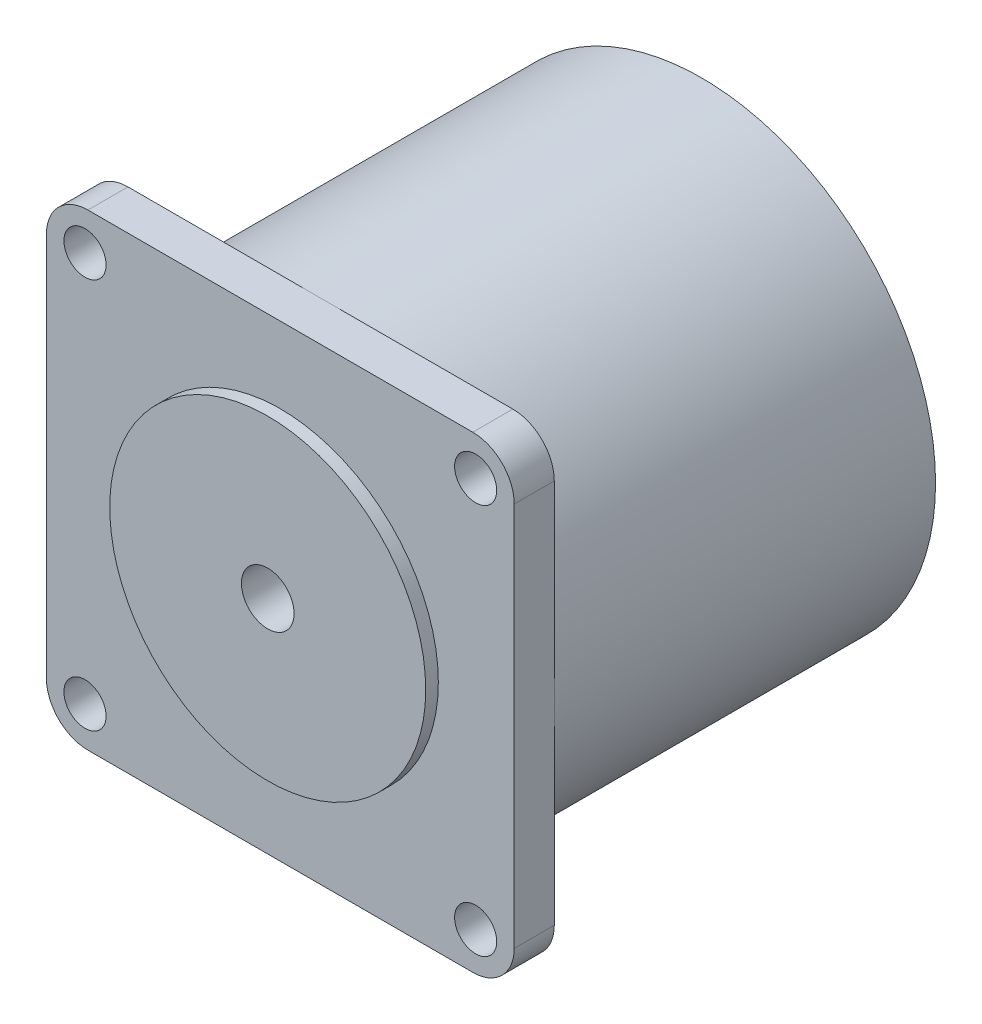
ISO-10303-21;
HEADER;
FILE_DESCRIPTION(('STEP AP214'),'2;1');
FILE_NAME('part.step','',(''),(''),'','','');
FILE_SCHEMA(('AUTOMOTIVE_DESIGN { 1 0 10303 214 1 1 1 1 }'));
ENDSEC;
DATA;
#1=APPLICATION_CONTEXT('core data for automotive mechanical design processes');
#2=APPLICATION_PROTOCOL_DEFINITION('international standard','automotive_design',2000,#1);
#3=PRODUCT_CONTEXT('',#1,'mechanical');
#4=PRODUCT('Part','Part','',(#3));
#5=PRODUCT_RELATED_PRODUCT_CATEGORY('part','',(#4));
#6=PRODUCT_DEFINITION_FORMATION('','',#4);
#7=PRODUCT_DEFINITION_CONTEXT('part definition',#1,'design');
#8=PRODUCT_DEFINITION('design','',#6,#7);
#9=PRODUCT_DEFINITION_SHAPE('','',#8);
#10=(LENGTH_UNIT() NAMED_UNIT(*) SI_UNIT(.MILLI.,.METRE.));
#11=(NAMED_UNIT(*) PLANE_ANGLE_UNIT() SI_UNIT($,.RADIAN.));
#12=(NAMED_UNIT(*) SI_UNIT($,.STERADIAN.) SOLID_ANGLE_UNIT());
#13=UNCERTAINTY_MEASURE_WITH_UNIT(LENGTH_MEASURE(1.E-05),#10,'distance_accuracy_value','');
#14=(GEOMETRIC_REPRESENTATION_CONTEXT(3) GLOBAL_UNCERTAINTY_ASSIGNED_CONTEXT((#13)) GLOBAL_UNIT_ASSIGNED_CONTEXT((#10,
#11,#12)) REPRESENTATION_CONTEXT('',''));
#15=CARTESIAN_POINT('',(0.,0.,0.));
#16=DIRECTION('',(0.,0.,1.));
#17=DIRECTION('',(1.,0.,0.));
#18=AXIS2_PLACEMENT_3D('',#15,#16,#17);
#19=CARTESIAN_POINT('',(0.,0.,45.97));
#20=DIRECTION('',(0.,0.,-1.));
#21=DIRECTION('',(-1.,0.,0.));
#22=AXIS2_PLACEMENT_3D('',#19,#20,#21);
#23=CYLINDRICAL_SURFACE('',#22,28.2);
#24=CARTESIAN_POINT('',(0.,0.,45.97));
#25=DIRECTION('',(0.,0.,1.));
#26=DIRECTION('',(1.,0.,0.));
#27=AXIS2_PLACEMENT_3D('',#24,#25,#26);
#28=CIRCLE('',#27,28.2);
#29=CARTESIAN_POINT('',(28.2,0.,45.97));
#30=VERTEX_POINT('',#29);
#31=CARTESIAN_POINT('',(0.,28.2,45.97));
#32=VERTEX_POINT('',#31);
#33=EDGE_CURVE('E38',#30,#32,#28,.T.);
#34=ORIENTED_EDGE('',*,*,#33,.F.);
#35=CARTESIAN_POINT('',(0.,-28.2,45.97));
#36=VERTEX_POINT('',#35);
#37=EDGE_CURVE('E50',#36,#30,#28,.T.);
#38=ORIENTED_EDGE('',*,*,#37,.F.);
#39=CARTESIAN_POINT('',(-28.2,0.,45.97));
#40=VERTEX_POINT('',#39);
#41=EDGE_CURVE('E54',#40,#36,#28,.T.);
#42=ORIENTED_EDGE('',*,*,#41,.F.);
#43=EDGE_CURVE('E117',#32,#40,#28,.T.);
#44=ORIENTED_EDGE('',*,*,#43,.F.);
#45=EDGE_LOOP('',(#34,#38,#42,#44));
#46=FACE_BOUND('',#45,.T.);
#47=CARTESIAN_POINT('',(0.,0.,0.));
#48=DIRECTION('',(0.,0.,1.));
#49=DIRECTION('',(1.,0.,0.));
#50=AXIS2_PLACEMENT_3D('',#47,#48,#49);
#51=CIRCLE('',#50,28.2);
#52=CARTESIAN_POINT('',(28.2,0.,0.));
#53=VERTEX_POINT('',#52);
#54=EDGE_CURVE('E131',#53,#53,#51,.T.);
#55=ORIENTED_EDGE('',*,*,#54,.T.);
#56=EDGE_LOOP('',(#55));
#57=FACE_BOUND('',#56,.T.);
#58=ADVANCED_FACE('F35',(#46,#57),#23,.T.);
#59=CARTESIAN_POINT('',(0.,0.,0.));
#60=DIRECTION('',(0.,0.,1.));
#61=DIRECTION('',(1.,0.,0.));
#62=AXIS2_PLACEMENT_3D('',#59,#60,#61);
#63=PLANE('',#62);
#64=ORIENTED_EDGE('',*,*,#54,.F.);
#65=EDGE_LOOP('',(#64));
#66=FACE_BOUND('',#65,.T.);
#67=ADVANCED_FACE('F251',(#66),#63,.F.);
#68=CARTESIAN_POINT('',(-23.2,23.2,45.97));
#69=DIRECTION('',(0.,0.,1.));
#70=DIRECTION('',(1.,0.,0.));
#71=AXIS2_PLACEMENT_3D('',#68,#69,#70);
#72=PLANE('',#71);
#73=CARTESIAN_POINT('',(23.55,23.55,45.97));
#74=DIRECTION('',(0.,0.,1.));
#75=DIRECTION('',(1.,0.,0.));
#76=AXIS2_PLACEMENT_3D('',#73,#74,#75);
#77=CIRCLE('',#76,2.54);
#78=CARTESIAN_POINT('',(26.09,23.55,45.97));
#79=VERTEX_POINT('',#78);
#80=EDGE_CURVE('E355',#79,#79,#77,.T.);
#81=ORIENTED_EDGE('',*,*,#80,.T.);
#82=EDGE_LOOP('',(#81));
#83=FACE_BOUND('',#82,.T.);
#84=DIRECTION('',(0.,1.,0.));
#85=VECTOR('',#84,1.);
#86=CARTESIAN_POINT('',(28.2,-23.2,45.97));
#87=LINE('',#86,#85);
#88=CARTESIAN_POINT('',(28.2,23.2,45.97));
#89=VERTEX_POINT('',#88);
#90=EDGE_CURVE('E151',#30,#89,#87,.T.);
#91=ORIENTED_EDGE('',*,*,#90,.F.);
#92=ORIENTED_EDGE('',*,*,#33,.T.);
#93=DIRECTION('',(1.,0.,0.));
#94=VECTOR('',#93,1.);
#95=CARTESIAN_POINT('',(-23.2,28.2,45.97));
#96=LINE('',#95,#94);
#97=CARTESIAN_POINT('',(23.2,28.2,45.97));
#98=VERTEX_POINT('',#97);
#99=EDGE_CURVE('E158',#32,#98,#96,.T.);
#100=ORIENTED_EDGE('',*,*,#99,.T.);
#101=CARTESIAN_POINT('',(23.2,23.2,45.97));
#102=DIRECTION('',(0.,0.,1.));
#103=DIRECTION('',(1.,0.,0.));
#104=AXIS2_PLACEMENT_3D('',#101,#102,#103);
#105=CIRCLE('',#104,5.00000000000001);
#106=EDGE_CURVE('E155',#89,#98,#105,.T.);
#107=ORIENTED_EDGE('',*,*,#106,.F.);
#108=EDGE_LOOP('',(#91,#92,#100,#107));
#109=FACE_BOUND('',#108,.T.);
#110=ADVANCED_FACE('F203',(#83,#109),#72,.F.);
#111=CARTESIAN_POINT('',(-23.55,23.55,45.97));
#112=DIRECTION('',(0.,0.,1.));
#113=DIRECTION('',(1.,0.,0.));
#114=AXIS2_PLACEMENT_3D('',#111,#112,#113);
#115=CIRCLE('',#114,2.54);
#116=CARTESIAN_POINT('',(-21.01,23.55,45.97));
#117=VERTEX_POINT('',#116);
#118=EDGE_CURVE('E139',#117,#117,#115,.T.);
#119=ORIENTED_EDGE('',*,*,#118,.T.);
#120=EDGE_LOOP('',(#119));
#121=FACE_BOUND('',#120,.T.);
#122=CARTESIAN_POINT('',(-23.2,28.2,45.97));
#123=VERTEX_POINT('',#122);
#124=EDGE_CURVE('E159',#123,#32,#96,.T.);
#125=ORIENTED_EDGE('',*,*,#124,.T.);
#126=ORIENTED_EDGE('',*,*,#43,.T.);
#127=DIRECTION('',(0.,-1.,0.));
#128=VECTOR('',#127,1.);
#129=CARTESIAN_POINT('',(-28.2,23.2,45.97));
#130=LINE('',#129,#128);
#131=CARTESIAN_POINT('',(-28.2,23.2,45.97));
#132=VERTEX_POINT('',#131);
#133=EDGE_CURVE('E110',#132,#40,#130,.T.);
#134=ORIENTED_EDGE('',*,*,#133,.F.);
#135=CARTESIAN_POINT('',(-23.2,23.2,45.97));
#136=DIRECTION('',(0.,0.,1.));
#137=DIRECTION('',(1.,0.,0.));
#138=AXIS2_PLACEMENT_3D('',#135,#136,#137);
#139=CIRCLE('',#138,5.);
#140=EDGE_CURVE('E115',#123,#132,#139,.T.);
#141=ORIENTED_EDGE('',*,*,#140,.F.);
#142=EDGE_LOOP('',(#125,#126,#134,#141));
#143=FACE_BOUND('',#142,.T.);
#144=ADVANCED_FACE('F113',(#121,#143),#72,.F.);
#145=CARTESIAN_POINT('',(-23.55,-23.55,45.97));
#146=DIRECTION('',(0.,0.,1.));
#147=DIRECTION('',(1.,0.,0.));
#148=AXIS2_PLACEMENT_3D('',#145,#146,#147);
#149=CIRCLE('',#148,2.54);
#150=CARTESIAN_POINT('',(-21.01,-23.55,45.97));
#151=VERTEX_POINT('',#150);
#152=EDGE_CURVE('E364',#151,#151,#149,.T.);
#153=ORIENTED_EDGE('',*,*,#152,.T.);
#154=EDGE_LOOP('',(#153));
#155=FACE_BOUND('',#154,.T.);
#156=CARTESIAN_POINT('',(-28.2,-23.2,45.97));
#157=VERTEX_POINT('',#156);
#158=EDGE_CURVE('E121',#40,#157,#130,.T.);
#159=ORIENTED_EDGE('',*,*,#158,.F.);
#160=ORIENTED_EDGE('',*,*,#41,.T.);
#161=DIRECTION('',(-1.,0.,0.));
#162=VECTOR('',#161,1.);
#163=CARTESIAN_POINT('',(23.2,-28.2,45.97));
#164=LINE('',#163,#162);
#165=CARTESIAN_POINT('',(-23.2,-28.2,45.97));
#166=VERTEX_POINT('',#165);
#167=EDGE_CURVE('E144',#36,#166,#164,.T.);
#168=ORIENTED_EDGE('',*,*,#167,.T.);
#169=CARTESIAN_POINT('',(-23.2,-23.2,45.97));
#170=DIRECTION('',(0.,0.,1.));
#171=DIRECTION('',(1.,0.,0.));
#172=AXIS2_PLACEMENT_3D('',#169,#170,#171);
#173=CIRCLE('',#172,5.);
#174=EDGE_CURVE('E120',#157,#166,#173,.T.);
#175=ORIENTED_EDGE('',*,*,#174,.F.);
#176=EDGE_LOOP('',(#159,#160,#168,#175));
#177=FACE_BOUND('',#176,.T.);
#178=ADVANCED_FACE('F229',(#155,#177),#72,.F.);
#179=CARTESIAN_POINT('',(23.55,-23.55,45.97));
#180=DIRECTION('',(0.,0.,1.));
#181=DIRECTION('',(1.,0.,0.));
#182=AXIS2_PLACEMENT_3D('',#179,#180,#181);
#183=CIRCLE('',#182,2.54);
#184=CARTESIAN_POINT('',(26.09,-23.55,45.97));
#185=VERTEX_POINT('',#184);
#186=EDGE_CURVE('E350',#185,#185,#183,.T.);
#187=ORIENTED_EDGE('',*,*,#186,.T.);
#188=EDGE_LOOP('',(#187));
#189=FACE_BOUND('',#188,.T.);
#190=CARTESIAN_POINT('',(23.2,-28.2,45.97));
#191=VERTEX_POINT('',#190);
#192=EDGE_CURVE('E145',#191,#36,#164,.T.);
#193=ORIENTED_EDGE('',*,*,#192,.T.);
#194=ORIENTED_EDGE('',*,*,#37,.T.);
#195=CARTESIAN_POINT('',(28.2,-23.2,45.97));
#196=VERTEX_POINT('',#195);
#197=EDGE_CURVE('E152',#196,#30,#87,.T.);
#198=ORIENTED_EDGE('',*,*,#197,.F.);
#199=CARTESIAN_POINT('',(23.2,-23.2,45.97));
#200=DIRECTION('',(0.,0.,-1.));
#201=DIRECTION('',(-1.,0.,0.));
#202=AXIS2_PLACEMENT_3D('',#199,#200,#201);
#203=CIRCLE('',#202,5.);
#204=EDGE_CURVE('E148',#196,#191,#203,.T.);
#205=ORIENTED_EDGE('',*,*,#204,.T.);
#206=EDGE_LOOP('',(#193,#194,#198,#205));
#207=FACE_BOUND('',#206,.T.);
#208=ADVANCED_FACE('F218',(#189,#207),#72,.F.);
#209=CARTESIAN_POINT('',(-23.2,23.2,50.8));
#210=DIRECTION('',(0.,0.,-1.));
#211=DIRECTION('',(-1.,0.,0.));
#212=AXIS2_PLACEMENT_3D('',#209,#210,#211);
#213=CYLINDRICAL_SURFACE('',#212,5.);
#214=ORIENTED_EDGE('',*,*,#140,.T.);
#215=DIRECTION('',(0.,0.,-1.));
#216=VECTOR('',#215,1.);
#217=CARTESIAN_POINT('',(-28.2,23.2,50.8));
#218=LINE('',#217,#216);
#219=CARTESIAN_POINT('',(-28.2,23.2,50.8));
#220=VERTEX_POINT('',#219);
#221=EDGE_CURVE('E124',#220,#132,#218,.T.);
#222=ORIENTED_EDGE('',*,*,#221,.F.);
#223=CARTESIAN_POINT('',(-23.2,23.2,50.8));
#224=DIRECTION('',(0.,0.,1.));
#225=DIRECTION('',(1.,0.,0.));
#226=AXIS2_PLACEMENT_3D('',#223,#224,#225);
#227=CIRCLE('',#226,5.);
#228=CARTESIAN_POINT('',(-23.2,28.2,50.8));
#229=VERTEX_POINT('',#228);
#230=EDGE_CURVE('E161',#229,#220,#227,.T.);
#231=ORIENTED_EDGE('',*,*,#230,.F.);
#232=DIRECTION('',(0.,0.,-1.));
#233=VECTOR('',#232,1.);
#234=CARTESIAN_POINT('',(-23.2,28.2,50.8));
#235=LINE('',#234,#233);
#236=EDGE_CURVE('E135',#229,#123,#235,.T.);
#237=ORIENTED_EDGE('',*,*,#236,.T.);
#238=EDGE_LOOP('',(#214,#222,#231,#237));
#239=FACE_BOUND('',#238,.T.);
#240=ADVANCED_FACE('F134',(#239),#213,.T.);
#241=CARTESIAN_POINT('',(-28.2,23.2,50.8));
#242=DIRECTION('',(1.,0.,0.));
#243=DIRECTION('',(0.,1.,0.));
#244=AXIS2_PLACEMENT_3D('',#241,#242,#243);
#245=PLANE('',#244);
#246=ORIENTED_EDGE('',*,*,#133,.T.);
#247=ORIENTED_EDGE('',*,*,#158,.T.);
#248=DIRECTION('',(0.,0.,-1.));
#249=VECTOR('',#248,1.);
#250=CARTESIAN_POINT('',(-28.2,-23.2,50.8));
#251=LINE('',#250,#249);
#252=CARTESIAN_POINT('',(-28.2,-23.2,50.8));
#253=VERTEX_POINT('',#252);
#254=EDGE_CURVE('E132',#253,#157,#251,.T.);
#255=ORIENTED_EDGE('',*,*,#254,.F.);
#256=DIRECTION('',(0.,-1.,0.));
#257=VECTOR('',#256,1.);
#258=CARTESIAN_POINT('',(-28.2,23.2,50.8));
#259=LINE('',#258,#257);
#260=EDGE_CURVE('E127',#220,#253,#259,.T.);
#261=ORIENTED_EDGE('',*,*,#260,.F.);
#262=ORIENTED_EDGE('',*,*,#221,.T.);
#263=EDGE_LOOP('',(#246,#247,#255,#261,#262));
#264=FACE_BOUND('',#263,.T.);
#265=ADVANCED_FACE('F125',(#264),#245,.F.);
#266=CARTESIAN_POINT('',(-23.2,-23.2,50.8));
#267=DIRECTION('',(0.,0.,-1.));
#268=DIRECTION('',(-1.,0.,0.));
#269=AXIS2_PLACEMENT_3D('',#266,#267,#268);
#270=CYLINDRICAL_SURFACE('',#269,5.);
#271=ORIENTED_EDGE('',*,*,#174,.T.);
#272=DIRECTION('',(0.,0.,-1.));
#273=VECTOR('',#272,1.);
#274=CARTESIAN_POINT('',(-23.2,-28.2,50.8));
#275=LINE('',#274,#273);
#276=CARTESIAN_POINT('',(-23.2,-28.2,50.8));
#277=VERTEX_POINT('',#276);
#278=EDGE_CURVE('E190',#277,#166,#275,.T.);
#279=ORIENTED_EDGE('',*,*,#278,.F.);
#280=CARTESIAN_POINT('',(-23.2,-23.2,50.8));
#281=DIRECTION('',(0.,0.,1.));
#282=DIRECTION('',(1.,0.,0.));
#283=AXIS2_PLACEMENT_3D('',#280,#281,#282);
#284=CIRCLE('',#283,5.);
#285=EDGE_CURVE('E164',#253,#277,#284,.T.);
#286=ORIENTED_EDGE('',*,*,#285,.F.);
#287=ORIENTED_EDGE('',*,*,#254,.T.);
#288=EDGE_LOOP('',(#271,#279,#286,#287));
#289=FACE_BOUND('',#288,.T.);
#290=ADVANCED_FACE('F232',(#289),#270,.T.);
#291=CARTESIAN_POINT('',(23.2,-28.2,50.8));
#292=DIRECTION('',(0.,-1.,0.));
#293=DIRECTION('',(1.,0.,0.));
#294=AXIS2_PLACEMENT_3D('',#291,#292,#293);
#295=PLANE('',#294);
#296=ORIENTED_EDGE('',*,*,#192,.F.);
#297=DIRECTION('',(0.,0.,-1.));
#298=VECTOR('',#297,1.);
#299=CARTESIAN_POINT('',(23.2,-28.2,50.8));
#300=LINE('',#299,#298);
#301=CARTESIAN_POINT('',(23.2,-28.2,50.8));
#302=VERTEX_POINT('',#301);
#303=EDGE_CURVE('E188',#302,#191,#300,.T.);
#304=ORIENTED_EDGE('',*,*,#303,.F.);
#305=DIRECTION('',(-1.,0.,0.));
#306=VECTOR('',#305,1.);
#307=CARTESIAN_POINT('',(23.2,-28.2,50.8));
#308=LINE('',#307,#306);
#309=EDGE_CURVE('E166',#302,#277,#308,.T.);
#310=ORIENTED_EDGE('',*,*,#309,.T.);
#311=ORIENTED_EDGE('',*,*,#278,.T.);
#312=ORIENTED_EDGE('',*,*,#167,.F.);
#313=EDGE_LOOP('',(#296,#304,#310,#311,#312));
#314=FACE_BOUND('',#313,.T.);
#315=ADVANCED_FACE('F225',(#314),#295,.T.);
#316=CARTESIAN_POINT('',(23.2,-23.2,50.8));
#317=DIRECTION('',(0.,0.,-1.));
#318=DIRECTION('',(-1.,0.,0.));
#319=AXIS2_PLACEMENT_3D('',#316,#317,#318);
#320=CYLINDRICAL_SURFACE('',#319,5.);
#321=ORIENTED_EDGE('',*,*,#204,.F.);
#322=DIRECTION('',(0.,0.,-1.));
#323=VECTOR('',#322,1.);
#324=CARTESIAN_POINT('',(28.2,-23.2,50.8));
#325=LINE('',#324,#323);
#326=CARTESIAN_POINT('',(28.2,-23.2,50.8));
#327=VERTEX_POINT('',#326);
#328=EDGE_CURVE('E186',#327,#196,#325,.T.);
#329=ORIENTED_EDGE('',*,*,#328,.F.);
#330=CARTESIAN_POINT('',(23.2,-23.2,50.8));
#331=DIRECTION('',(0.,0.,-1.));
#332=DIRECTION('',(-1.,0.,0.));
#333=AXIS2_PLACEMENT_3D('',#330,#331,#332);
#334=CIRCLE('',#333,5.);
#335=EDGE_CURVE('E169',#327,#302,#334,.T.);
#336=ORIENTED_EDGE('',*,*,#335,.T.);
#337=ORIENTED_EDGE('',*,*,#303,.T.);
#338=EDGE_LOOP('',(#321,#329,#336,#337));
#339=FACE_BOUND('',#338,.T.);
#340=ADVANCED_FACE('F220',(#339),#320,.T.);
#341=CARTESIAN_POINT('',(28.2,-23.2,50.8));
#342=DIRECTION('',(-1.,0.,0.));
#343=DIRECTION('',(0.,0.,1.));
#344=AXIS2_PLACEMENT_3D('',#341,#342,#343);
#345=PLANE('',#344);
#346=ORIENTED_EDGE('',*,*,#197,.T.);
#347=ORIENTED_EDGE('',*,*,#90,.T.);
#348=DIRECTION('',(0.,0.,-1.));
#349=VECTOR('',#348,1.);
#350=CARTESIAN_POINT('',(28.2,23.2,50.8));
#351=LINE('',#350,#349);
#352=CARTESIAN_POINT('',(28.2,23.2,50.8));
#353=VERTEX_POINT('',#352);
#354=EDGE_CURVE('E183',#353,#89,#351,.T.);
#355=ORIENTED_EDGE('',*,*,#354,.F.);
#356=DIRECTION('',(0.,1.,0.));
#357=VECTOR('',#356,1.);
#358=CARTESIAN_POINT('',(28.2,-23.2,50.8));
#359=LINE('',#358,#357);
#360=EDGE_CURVE('E172',#327,#353,#359,.T.);
#361=ORIENTED_EDGE('',*,*,#360,.F.);
#362=ORIENTED_EDGE('',*,*,#328,.T.);
#363=EDGE_LOOP('',(#346,#347,#355,#361,#362));
#364=FACE_BOUND('',#363,.T.);
#365=ADVANCED_FACE('F215',(#364),#345,.F.);
#366=CARTESIAN_POINT('',(23.2,23.2,50.8));
#367=DIRECTION('',(0.,0.,-1.));
#368=DIRECTION('',(-1.,0.,0.));
#369=AXIS2_PLACEMENT_3D('',#366,#367,#368);
#370=CYLINDRICAL_SURFACE('',#369,5.00000000000001);
#371=ORIENTED_EDGE('',*,*,#106,.T.);
#372=DIRECTION('',(0.,0.,-1.));
#373=VECTOR('',#372,1.);
#374=CARTESIAN_POINT('',(23.2,28.2,50.8));
#375=LINE('',#374,#373);
#376=CARTESIAN_POINT('',(23.2,28.2,50.8));
#377=VERTEX_POINT('',#376);
#378=EDGE_CURVE('E180',#377,#98,#375,.T.);
#379=ORIENTED_EDGE('',*,*,#378,.F.);
#380=CARTESIAN_POINT('',(23.2,23.2,50.8));
#381=DIRECTION('',(0.,0.,1.));
#382=DIRECTION('',(1.,0.,0.));
#383=AXIS2_PLACEMENT_3D('',#380,#381,#382);
#384=CIRCLE('',#383,5.00000000000001);
#385=EDGE_CURVE('E174',#353,#377,#384,.T.);
#386=ORIENTED_EDGE('',*,*,#385,.F.);
#387=ORIENTED_EDGE('',*,*,#354,.T.);
#388=EDGE_LOOP('',(#371,#379,#386,#387));
#389=FACE_BOUND('',#388,.T.);
#390=ADVANCED_FACE('F211',(#389),#370,.T.);
#391=CARTESIAN_POINT('',(-23.2,28.2,50.8));
#392=DIRECTION('',(0.,1.,0.));
#393=DIRECTION('',(-1.,0.,0.));
#394=AXIS2_PLACEMENT_3D('',#391,#392,#393);
#395=PLANE('',#394);
#396=ORIENTED_EDGE('',*,*,#124,.F.);
#397=ORIENTED_EDGE('',*,*,#236,.F.);
#398=DIRECTION('',(1.,0.,0.));
#399=VECTOR('',#398,1.);
#400=CARTESIAN_POINT('',(-23.2,28.2,50.8));
#401=LINE('',#400,#399);
#402=EDGE_CURVE('E176',#229,#377,#401,.T.);
#403=ORIENTED_EDGE('',*,*,#402,.T.);
#404=ORIENTED_EDGE('',*,*,#378,.T.);
#405=ORIENTED_EDGE('',*,*,#99,.F.);
#406=EDGE_LOOP('',(#396,#397,#403,#404,#405));
#407=FACE_BOUND('',#406,.T.);
#408=ADVANCED_FACE('F206',(#407),#395,.T.);
#409=CARTESIAN_POINT('',(-23.2,23.2,50.8));
#410=DIRECTION('',(0.,0.,1.));
#411=DIRECTION('',(1.,0.,0.));
#412=AXIS2_PLACEMENT_3D('',#409,#410,#411);
#413=PLANE('',#412);
#414=CARTESIAN_POINT('',(23.55,-23.55,50.8));
#415=DIRECTION('',(0.,0.,1.));
#416=DIRECTION('',(1.,0.,0.));
#417=AXIS2_PLACEMENT_3D('',#414,#415,#416);
#418=CIRCLE('',#417,2.54);
#419=CARTESIAN_POINT('',(26.09,-23.55,50.8));
#420=VERTEX_POINT('',#419);
#421=EDGE_CURVE('E347',#420,#420,#418,.T.);
#422=ORIENTED_EDGE('',*,*,#421,.F.);
#423=EDGE_LOOP('',(#422));
#424=FACE_BOUND('',#423,.T.);
#425=CARTESIAN_POINT('',(23.55,23.55,50.8));
#426=DIRECTION('',(0.,0.,1.));
#427=DIRECTION('',(1.,0.,0.));
#428=AXIS2_PLACEMENT_3D('',#425,#426,#427);
#429=CIRCLE('',#428,2.54);
#430=CARTESIAN_POINT('',(26.09,23.55,50.8));
#431=VERTEX_POINT('',#430);
#432=EDGE_CURVE('E352',#431,#431,#429,.T.);
#433=ORIENTED_EDGE('',*,*,#432,.F.);
#434=EDGE_LOOP('',(#433));
#435=FACE_BOUND('',#434,.T.);
#436=CARTESIAN_POINT('',(-23.55,-23.55,50.8));
#437=DIRECTION('',(0.,0.,1.));
#438=DIRECTION('',(1.,0.,0.));
#439=AXIS2_PLACEMENT_3D('',#436,#437,#438);
#440=CIRCLE('',#439,2.54);
#441=CARTESIAN_POINT('',(-21.01,-23.55,50.8));
#442=VERTEX_POINT('',#441);
#443=EDGE_CURVE('E361',#442,#442,#440,.T.);
#444=ORIENTED_EDGE('',*,*,#443,.F.);
#445=EDGE_LOOP('',(#444));
#446=FACE_BOUND('',#445,.T.);
#447=CARTESIAN_POINT('',(-23.55,23.55,50.8));
#448=DIRECTION('',(0.,0.,1.));
#449=DIRECTION('',(1.,0.,0.));
#450=AXIS2_PLACEMENT_3D('',#447,#448,#449);
#451=CIRCLE('',#450,2.54);
#452=CARTESIAN_POINT('',(-21.01,23.55,50.8));
#453=VERTEX_POINT('',#452);
#454=EDGE_CURVE('E373',#453,#453,#451,.T.);
#455=ORIENTED_EDGE('',*,*,#454,.F.);
#456=EDGE_LOOP('',(#455));
#457=FACE_BOUND('',#456,.T.);
#458=CARTESIAN_POINT('',(0.,0.,50.8));
#459=DIRECTION('',(0.,0.,1.));
#460=DIRECTION('',(1.,0.,0.));
#461=AXIS2_PLACEMENT_3D('',#458,#459,#460);
#462=CIRCLE('',#461,19.05);
#463=CARTESIAN_POINT('',(19.05,0.,50.8));
#464=VERTEX_POINT('',#463);
#465=EDGE_CURVE('E11',#464,#464,#462,.T.);
#466=ORIENTED_EDGE('',*,*,#465,.F.);
#467=EDGE_LOOP('',(#466));
#468=FACE_BOUND('',#467,.T.);
#469=ORIENTED_EDGE('',*,*,#230,.T.);
#470=ORIENTED_EDGE('',*,*,#260,.T.);
#471=ORIENTED_EDGE('',*,*,#285,.T.);
#472=ORIENTED_EDGE('',*,*,#309,.F.);
#473=ORIENTED_EDGE('',*,*,#335,.F.);
#474=ORIENTED_EDGE('',*,*,#360,.T.);
#475=ORIENTED_EDGE('',*,*,#385,.T.);
#476=ORIENTED_EDGE('',*,*,#402,.F.);
#477=EDGE_LOOP('',(#469,#470,#471,#472,#473,#474,#475,#476));
#478=FACE_BOUND('',#477,.T.);
#479=ADVANCED_FACE('F234',(#424,#435,#446,#457,#468,#478),#413,.T.);
#480=CARTESIAN_POINT('',(0.,0.,52.32));
#481=DIRECTION('',(0.,0.,-1.));
#482=DIRECTION('',(-1.,0.,0.));
#483=AXIS2_PLACEMENT_3D('',#480,#481,#482);
#484=CYLINDRICAL_SURFACE('',#483,19.05);
#485=CARTESIAN_POINT('',(0.,0.,52.32));
#486=DIRECTION('',(0.,0.,1.));
#487=DIRECTION('',(1.,0.,0.));
#488=AXIS2_PLACEMENT_3D('',#485,#486,#487);
#489=CIRCLE('',#488,19.05);
#490=CARTESIAN_POINT('',(19.05,0.,52.32));
#491=VERTEX_POINT('',#490);
#492=EDGE_CURVE('E136',#491,#491,#489,.T.);
#493=ORIENTED_EDGE('',*,*,#492,.F.);
#494=EDGE_LOOP('',(#493));
#495=FACE_BOUND('',#494,.T.);
#496=ORIENTED_EDGE('',*,*,#465,.T.);
#497=EDGE_LOOP('',(#496));
#498=FACE_BOUND('',#497,.T.);
#499=ADVANCED_FACE('F236',(#495,#498),#484,.T.);
#500=CARTESIAN_POINT('',(0.,0.,52.32));
#501=DIRECTION('',(0.,0.,1.));
#502=DIRECTION('',(1.,0.,0.));
#503=AXIS2_PLACEMENT_3D('',#500,#501,#502);
#504=PLANE('',#503);
#505=CARTESIAN_POINT('',(0.,0.,52.32));
#506=DIRECTION('',(0.,0.,1.));
#507=DIRECTION('',(1.,0.,0.));
#508=AXIS2_PLACEMENT_3D('',#505,#506,#507);
#509=CIRCLE('',#508,3.175);
#510=CARTESIAN_POINT('',(3.175,0.,52.32));
#511=VERTEX_POINT('',#510);
#512=EDGE_CURVE('E367',#511,#511,#509,.T.);
#513=ORIENTED_EDGE('',*,*,#512,.F.);
#514=EDGE_LOOP('',(#513));
#515=FACE_BOUND('',#514,.T.);
#516=ORIENTED_EDGE('',*,*,#492,.T.);
#517=EDGE_LOOP('',(#516));
#518=FACE_BOUND('',#517,.T.);
#519=ADVANCED_FACE('F243',(#515,#518),#504,.T.);
#520=CARTESIAN_POINT('',(-23.55,23.55,0.));
#521=DIRECTION('',(0.,0.,1.));
#522=DIRECTION('',(1.,0.,0.));
#523=AXIS2_PLACEMENT_3D('',#520,#521,#522);
#524=CYLINDRICAL_SURFACE('',#523,2.54);
#525=ORIENTED_EDGE('',*,*,#454,.T.);
#526=EDGE_LOOP('',(#525));
#527=FACE_BOUND('',#526,.T.);
#528=ORIENTED_EDGE('',*,*,#118,.F.);
#529=EDGE_LOOP('',(#528));
#530=FACE_BOUND('',#529,.T.);
#531=ADVANCED_FACE('F295',(#527,#530),#524,.F.);
#532=CARTESIAN_POINT('',(0.,0.,22.32));
#533=DIRECTION('',(0.,0.,1.));
#534=DIRECTION('',(1.,0.,0.));
#535=AXIS2_PLACEMENT_3D('',#532,#533,#534);
#536=CYLINDRICAL_SURFACE('',#535,3.175);
#537=CARTESIAN_POINT('',(0.,0.,22.32));
#538=DIRECTION('',(0.,0.,1.));
#539=DIRECTION('',(1.,0.,0.));
#540=AXIS2_PLACEMENT_3D('',#537,#538,#539);
#541=CIRCLE('',#540,3.175);
#542=CARTESIAN_POINT('',(3.175,0.,22.32));
#543=VERTEX_POINT('',#542);
#544=EDGE_CURVE('E370',#543,#543,#541,.T.);
#545=ORIENTED_EDGE('',*,*,#544,.F.);
#546=EDGE_LOOP('',(#545));
#547=FACE_BOUND('',#546,.T.);
#548=ORIENTED_EDGE('',*,*,#512,.T.);
#549=EDGE_LOOP('',(#548));
#550=FACE_BOUND('',#549,.T.);
#551=ADVANCED_FACE('F303',(#547,#550),#536,.F.);
#552=CARTESIAN_POINT('',(0.,0.,22.32));
#553=DIRECTION('',(0.,0.,1.));
#554=DIRECTION('',(1.,0.,0.));
#555=AXIS2_PLACEMENT_3D('',#552,#553,#554);
#556=PLANE('',#555);
#557=ORIENTED_EDGE('',*,*,#544,.T.);
#558=EDGE_LOOP('',(#557));
#559=FACE_BOUND('',#558,.T.);
#560=ADVANCED_FACE('F311',(#559),#556,.T.);
#561=CARTESIAN_POINT('',(-23.55,-23.55,0.));
#562=DIRECTION('',(0.,0.,1.));
#563=DIRECTION('',(1.,0.,0.));
#564=AXIS2_PLACEMENT_3D('',#561,#562,#563);
#565=CYLINDRICAL_SURFACE('',#564,2.54);
#566=ORIENTED_EDGE('',*,*,#443,.T.);
#567=EDGE_LOOP('',(#566));
#568=FACE_BOUND('',#567,.T.);
#569=ORIENTED_EDGE('',*,*,#152,.F.);
#570=EDGE_LOOP('',(#569));
#571=FACE_BOUND('',#570,.T.);
#572=ADVANCED_FACE('F319',(#568,#571),#565,.F.);
#573=CARTESIAN_POINT('',(23.55,23.55,0.));
#574=DIRECTION('',(0.,0.,1.));
#575=DIRECTION('',(1.,0.,0.));
#576=AXIS2_PLACEMENT_3D('',#573,#574,#575);
#577=CYLINDRICAL_SURFACE('',#576,2.54);
#578=ORIENTED_EDGE('',*,*,#432,.T.);
#579=EDGE_LOOP('',(#578));
#580=FACE_BOUND('',#579,.T.);
#581=ORIENTED_EDGE('',*,*,#80,.F.);
#582=EDGE_LOOP('',(#581));
#583=FACE_BOUND('',#582,.T.);
#584=ADVANCED_FACE('F327',(#580,#583),#577,.F.);
#585=CARTESIAN_POINT('',(23.55,-23.55,0.));
#586=DIRECTION('',(0.,0.,1.));
#587=DIRECTION('',(1.,0.,0.));
#588=AXIS2_PLACEMENT_3D('',#585,#586,#587);
#589=CYLINDRICAL_SURFACE('',#588,2.54);
#590=ORIENTED_EDGE('',*,*,#421,.T.);
#591=EDGE_LOOP('',(#590));
#592=FACE_BOUND('',#591,.T.);
#593=ORIENTED_EDGE('',*,*,#186,.F.);
#594=EDGE_LOOP('',(#593));
#595=FACE_BOUND('',#594,.T.);
#596=ADVANCED_FACE('F335',(#592,#595),#589,.F.);
#597=CLOSED_SHELL('',(#58,#67,#110,#144,#178,#208,#240,#265,#290,#315,#340,#365,#390,#408,#479,
#499,#519,#531,#551,#560,#572,#584,#596));
#598=MANIFOLD_SOLID_BREP('B2',#597);
#599=ADVANCED_BREP_SHAPE_REPRESENTATION('',(#18,#598),#14);
#600=SHAPE_DEFINITION_REPRESENTATION(#9,#599);
ENDSEC;
END-ISO-10303-21;
